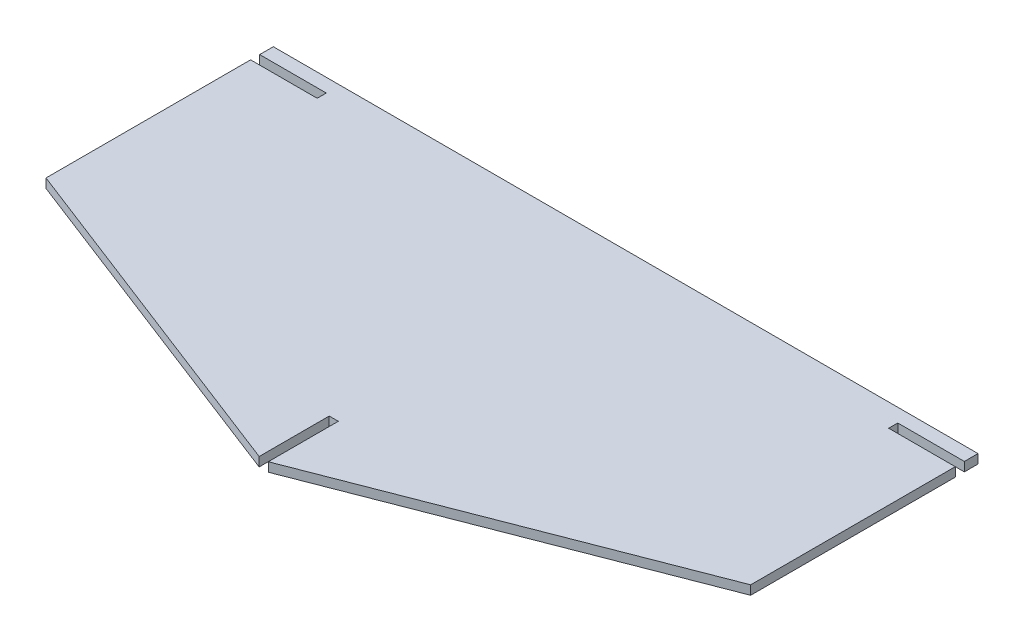
ISO-10303-21;
HEADER;
FILE_DESCRIPTION(('STEP AP214'),'2;1');
FILE_NAME('part.step','',(''),(''),'','','');
FILE_SCHEMA(('AUTOMOTIVE_DESIGN { 1 0 10303 214 1 1 1 1 }'));
ENDSEC;
DATA;
#1=APPLICATION_CONTEXT('core data for automotive mechanical design processes');
#2=APPLICATION_PROTOCOL_DEFINITION('international standard','automotive_design',2000,#1);
#3=PRODUCT_CONTEXT('',#1,'mechanical');
#4=PRODUCT('Part','Part','',(#3));
#5=PRODUCT_RELATED_PRODUCT_CATEGORY('part','',(#4));
#6=PRODUCT_DEFINITION_FORMATION('','',#4);
#7=PRODUCT_DEFINITION_CONTEXT('part definition',#1,'design');
#8=PRODUCT_DEFINITION('design','',#6,#7);
#9=PRODUCT_DEFINITION_SHAPE('','',#8);
#10=(LENGTH_UNIT() NAMED_UNIT(*) SI_UNIT(.MILLI.,.METRE.));
#11=(NAMED_UNIT(*) PLANE_ANGLE_UNIT() SI_UNIT($,.RADIAN.));
#12=(NAMED_UNIT(*) SI_UNIT($,.STERADIAN.) SOLID_ANGLE_UNIT());
#13=UNCERTAINTY_MEASURE_WITH_UNIT(LENGTH_MEASURE(1.E-05),#10,'distance_accuracy_value','');
#14=(GEOMETRIC_REPRESENTATION_CONTEXT(3) GLOBAL_UNCERTAINTY_ASSIGNED_CONTEXT((#13)) GLOBAL_UNIT_ASSIGNED_CONTEXT((#10,
#11,#12)) REPRESENTATION_CONTEXT('',''));
#15=CARTESIAN_POINT('',(0.,0.,0.));
#16=DIRECTION('',(0.,0.,1.));
#17=DIRECTION('',(1.,0.,0.));
#18=AXIS2_PLACEMENT_3D('',#15,#16,#17);
#19=CARTESIAN_POINT('',(74.0633484162896,4.,191.330316742081));
#20=DIRECTION('',(-0.360994102557712,0.,-0.93256809827409));
#21=DIRECTION('',(-0.93256809827409,0.,0.360994102557712));
#22=AXIS2_PLACEMENT_3D('',#19,#20,#21);
#23=PLANE('',#22);
#24=DIRECTION('',(0.93256809827409,0.,-0.360994102557712));
#25=VECTOR('',#24,1.);
#26=CARTESIAN_POINT('',(74.0633484162896,0.,191.330316742081));
#27=LINE('',#26,#25);
#28=CARTESIAN_POINT('',(157.,0.,159.225806451613));
#29=VERTEX_POINT('',#28);
#30=CARTESIAN_POINT('',(310.,0.,100.));
#31=VERTEX_POINT('',#30);
#32=EDGE_CURVE('E177',#29,#31,#27,.T.);
#33=ORIENTED_EDGE('',*,*,#32,.T.);
#34=DIRECTION('',(0.,-1.,0.));
#35=VECTOR('',#34,1.);
#36=CARTESIAN_POINT('',(310.,4.,100.));
#37=LINE('',#36,#35);
#38=CARTESIAN_POINT('',(310.,4.,100.));
#39=VERTEX_POINT('',#38);
#40=EDGE_CURVE('E11',#39,#31,#37,.T.);
#41=ORIENTED_EDGE('',*,*,#40,.F.);
#42=DIRECTION('',(0.93256809827409,0.,-0.360994102557712));
#43=VECTOR('',#42,1.);
#44=CARTESIAN_POINT('',(74.0633484162896,4.,191.330316742081));
#45=LINE('',#44,#43);
#46=CARTESIAN_POINT('',(157.,4.,159.225806451613));
#47=VERTEX_POINT('',#46);
#48=EDGE_CURVE('E112',#47,#39,#45,.T.);
#49=ORIENTED_EDGE('',*,*,#48,.F.);
#50=DIRECTION('',(0.,-1.,0.));
#51=VECTOR('',#50,1.);
#52=CARTESIAN_POINT('',(157.,4.,159.225806451613));
#53=LINE('',#52,#51);
#54=EDGE_CURVE('E50',#47,#29,#53,.T.);
#55=ORIENTED_EDGE('',*,*,#54,.T.);
#56=EDGE_LOOP('',(#33,#41,#49,#55));
#57=FACE_BOUND('',#56,.T.);
#58=ADVANCED_FACE('F34',(#57),#23,.F.);
#59=CARTESIAN_POINT('',(310.,4.,0.));
#60=DIRECTION('',(1.,0.,0.));
#61=DIRECTION('',(0.,0.,-1.));
#62=AXIS2_PLACEMENT_3D('',#59,#60,#61);
#63=PLANE('',#62);
#64=DIRECTION('',(0.,0.,1.));
#65=VECTOR('',#64,1.);
#66=CARTESIAN_POINT('',(310.,0.,0.));
#67=LINE('',#66,#65);
#68=CARTESIAN_POINT('',(310.,0.,10.));
#69=VERTEX_POINT('',#68);
#70=EDGE_CURVE('E179',#69,#31,#67,.T.);
#71=ORIENTED_EDGE('',*,*,#70,.F.);
#72=DIRECTION('',(0.,-1.,0.));
#73=VECTOR('',#72,1.);
#74=CARTESIAN_POINT('',(310.,4.,10.));
#75=LINE('',#74,#73);
#76=CARTESIAN_POINT('',(310.,4.,10.));
#77=VERTEX_POINT('',#76);
#78=EDGE_CURVE('E42',#77,#69,#75,.T.);
#79=ORIENTED_EDGE('',*,*,#78,.F.);
#80=DIRECTION('',(0.,0.,1.));
#81=VECTOR('',#80,1.);
#82=CARTESIAN_POINT('',(310.,4.,0.));
#83=LINE('',#82,#81);
#84=EDGE_CURVE('E252',#77,#39,#83,.T.);
#85=ORIENTED_EDGE('',*,*,#84,.T.);
#86=ORIENTED_EDGE('',*,*,#40,.T.);
#87=EDGE_LOOP('',(#71,#79,#85,#86));
#88=FACE_BOUND('',#87,.T.);
#89=ADVANCED_FACE('F251',(#88),#63,.T.);
#90=CARTESIAN_POINT('',(0.,4.,10.));
#91=DIRECTION('',(0.,0.,1.));
#92=DIRECTION('',(1.,0.,0.));
#93=AXIS2_PLACEMENT_3D('',#90,#91,#92);
#94=PLANE('',#93);
#95=DIRECTION('',(-1.,0.,0.));
#96=VECTOR('',#95,1.);
#97=CARTESIAN_POINT('',(0.,0.,10.));
#98=LINE('',#97,#96);
#99=CARTESIAN_POINT('',(280.7,0.,10.));
#100=VERTEX_POINT('',#99);
#101=EDGE_CURVE('E182',#69,#100,#98,.T.);
#102=ORIENTED_EDGE('',*,*,#101,.T.);
#103=DIRECTION('',(0.,-1.,0.));
#104=VECTOR('',#103,1.);
#105=CARTESIAN_POINT('',(280.7,4.,10.));
#106=LINE('',#105,#104);
#107=CARTESIAN_POINT('',(280.7,4.,10.));
#108=VERTEX_POINT('',#107);
#109=EDGE_CURVE('E238',#108,#100,#106,.T.);
#110=ORIENTED_EDGE('',*,*,#109,.F.);
#111=DIRECTION('',(-1.,0.,0.));
#112=VECTOR('',#111,1.);
#113=CARTESIAN_POINT('',(0.,4.,10.));
#114=LINE('',#113,#112);
#115=EDGE_CURVE('E244',#77,#108,#114,.T.);
#116=ORIENTED_EDGE('',*,*,#115,.F.);
#117=ORIENTED_EDGE('',*,*,#78,.T.);
#118=EDGE_LOOP('',(#102,#110,#116,#117));
#119=FACE_BOUND('',#118,.T.);
#120=ADVANCED_FACE('F242',(#119),#94,.F.);
#121=CARTESIAN_POINT('',(280.7,4.,0.));
#122=DIRECTION('',(1.,0.,0.));
#123=DIRECTION('',(0.,0.,-1.));
#124=AXIS2_PLACEMENT_3D('',#121,#122,#123);
#125=PLANE('',#124);
#126=DIRECTION('',(0.,0.,1.));
#127=VECTOR('',#126,1.);
#128=CARTESIAN_POINT('',(280.7,0.,0.));
#129=LINE('',#128,#127);
#130=CARTESIAN_POINT('',(280.7,0.,6.));
#131=VERTEX_POINT('',#130);
#132=EDGE_CURVE('E186',#131,#100,#129,.T.);
#133=ORIENTED_EDGE('',*,*,#132,.F.);
#134=DIRECTION('',(0.,-1.,0.));
#135=VECTOR('',#134,1.);
#136=CARTESIAN_POINT('',(280.7,4.,6.));
#137=LINE('',#136,#135);
#138=CARTESIAN_POINT('',(280.7,4.,6.));
#139=VERTEX_POINT('',#138);
#140=EDGE_CURVE('E236',#139,#131,#137,.T.);
#141=ORIENTED_EDGE('',*,*,#140,.F.);
#142=DIRECTION('',(0.,0.,1.));
#143=VECTOR('',#142,1.);
#144=CARTESIAN_POINT('',(280.7,4.,0.));
#145=LINE('',#144,#143);
#146=EDGE_CURVE('E411',#139,#108,#145,.T.);
#147=ORIENTED_EDGE('',*,*,#146,.T.);
#148=ORIENTED_EDGE('',*,*,#109,.T.);
#149=EDGE_LOOP('',(#133,#141,#147,#148));
#150=FACE_BOUND('',#149,.T.);
#151=ADVANCED_FACE('F272',(#150),#125,.T.);
#152=CARTESIAN_POINT('',(0.,4.,6.));
#153=DIRECTION('',(0.,0.,1.));
#154=DIRECTION('',(1.,0.,0.));
#155=AXIS2_PLACEMENT_3D('',#152,#153,#154);
#156=PLANE('',#155);
#157=DIRECTION('',(-1.,0.,0.));
#158=VECTOR('',#157,1.);
#159=CARTESIAN_POINT('',(0.,0.,6.));
#160=LINE('',#159,#158);
#161=CARTESIAN_POINT('',(310.,0.,6.));
#162=VERTEX_POINT('',#161);
#163=EDGE_CURVE('E189',#162,#131,#160,.T.);
#164=ORIENTED_EDGE('',*,*,#163,.F.);
#165=DIRECTION('',(0.,-1.,0.));
#166=VECTOR('',#165,1.);
#167=CARTESIAN_POINT('',(310.,4.,6.));
#168=LINE('',#167,#166);
#169=CARTESIAN_POINT('',(310.,4.,6.));
#170=VERTEX_POINT('',#169);
#171=EDGE_CURVE('E234',#170,#162,#168,.T.);
#172=ORIENTED_EDGE('',*,*,#171,.F.);
#173=DIRECTION('',(-1.,0.,0.));
#174=VECTOR('',#173,1.);
#175=CARTESIAN_POINT('',(0.,4.,6.));
#176=LINE('',#175,#174);
#177=EDGE_CURVE('E304',#170,#139,#176,.T.);
#178=ORIENTED_EDGE('',*,*,#177,.T.);
#179=ORIENTED_EDGE('',*,*,#140,.T.);
#180=EDGE_LOOP('',(#164,#172,#178,#179));
#181=FACE_BOUND('',#180,.T.);
#182=ADVANCED_FACE('F277',(#181),#156,.T.);
#183=CARTESIAN_POINT('',(310.,0.,0.));
#184=VERTEX_POINT('',#183);
#185=EDGE_CURVE('E183',#184,#162,#67,.T.);
#186=ORIENTED_EDGE('',*,*,#185,.F.);
#187=DIRECTION('',(0.,-1.,0.));
#188=VECTOR('',#187,1.);
#189=CARTESIAN_POINT('',(310.,4.,0.));
#190=LINE('',#189,#188);
#191=CARTESIAN_POINT('',(310.,4.,0.));
#192=VERTEX_POINT('',#191);
#193=EDGE_CURVE('E232',#192,#184,#190,.T.);
#194=ORIENTED_EDGE('',*,*,#193,.F.);
#195=EDGE_CURVE('E299',#192,#170,#83,.T.);
#196=ORIENTED_EDGE('',*,*,#195,.T.);
#197=ORIENTED_EDGE('',*,*,#171,.T.);
#198=EDGE_LOOP('',(#186,#194,#196,#197));
#199=FACE_BOUND('',#198,.T.);
#200=ADVANCED_FACE('F268',(#199),#63,.T.);
#201=CARTESIAN_POINT('',(0.,4.,0.));
#202=DIRECTION('',(0.,0.,-1.));
#203=DIRECTION('',(-1.,0.,0.));
#204=AXIS2_PLACEMENT_3D('',#201,#202,#203);
#205=PLANE('',#204);
#206=DIRECTION('',(1.,0.,0.));
#207=VECTOR('',#206,1.);
#208=CARTESIAN_POINT('',(0.,0.,0.));
#209=LINE('',#208,#207);
#210=CARTESIAN_POINT('',(0.,0.,0.));
#211=VERTEX_POINT('',#210);
#212=EDGE_CURVE('E192',#211,#184,#209,.T.);
#213=ORIENTED_EDGE('',*,*,#212,.F.);
#214=DIRECTION('',(0.,-1.,0.));
#215=VECTOR('',#214,1.);
#216=CARTESIAN_POINT('',(0.,4.,0.));
#217=LINE('',#216,#215);
#218=CARTESIAN_POINT('',(0.,4.,0.));
#219=VERTEX_POINT('',#218);
#220=EDGE_CURVE('E230',#219,#211,#217,.T.);
#221=ORIENTED_EDGE('',*,*,#220,.F.);
#222=DIRECTION('',(1.,0.,0.));
#223=VECTOR('',#222,1.);
#224=CARTESIAN_POINT('',(0.,4.,0.));
#225=LINE('',#224,#223);
#226=EDGE_CURVE('E297',#219,#192,#225,.T.);
#227=ORIENTED_EDGE('',*,*,#226,.T.);
#228=ORIENTED_EDGE('',*,*,#193,.T.);
#229=EDGE_LOOP('',(#213,#221,#227,#228));
#230=FACE_BOUND('',#229,.T.);
#231=ADVANCED_FACE('F276',(#230),#205,.T.);
#232=CARTESIAN_POINT('',(0.,4.,0.));
#233=DIRECTION('',(1.,0.,0.));
#234=DIRECTION('',(0.,0.,-1.));
#235=AXIS2_PLACEMENT_3D('',#232,#233,#234);
#236=PLANE('',#235);
#237=DIRECTION('',(0.,0.,1.));
#238=VECTOR('',#237,1.);
#239=CARTESIAN_POINT('',(0.,0.,0.));
#240=LINE('',#239,#238);
#241=CARTESIAN_POINT('',(0.,0.,6.));
#242=VERTEX_POINT('',#241);
#243=EDGE_CURVE('E195',#211,#242,#240,.T.);
#244=ORIENTED_EDGE('',*,*,#243,.T.);
#245=DIRECTION('',(0.,-1.,0.));
#246=VECTOR('',#245,1.);
#247=CARTESIAN_POINT('',(0.,4.,6.));
#248=LINE('',#247,#246);
#249=CARTESIAN_POINT('',(0.,4.,6.));
#250=VERTEX_POINT('',#249);
#251=EDGE_CURVE('E227',#250,#242,#248,.T.);
#252=ORIENTED_EDGE('',*,*,#251,.F.);
#253=DIRECTION('',(0.,0.,1.));
#254=VECTOR('',#253,1.);
#255=CARTESIAN_POINT('',(0.,4.,0.));
#256=LINE('',#255,#254);
#257=EDGE_CURVE('E298',#219,#250,#256,.T.);
#258=ORIENTED_EDGE('',*,*,#257,.F.);
#259=ORIENTED_EDGE('',*,*,#220,.T.);
#260=EDGE_LOOP('',(#244,#252,#258,#259));
#261=FACE_BOUND('',#260,.T.);
#262=ADVANCED_FACE('F283',(#261),#236,.F.);
#263=CARTESIAN_POINT('',(0.,4.,6.));
#264=DIRECTION('',(0.,0.,-1.));
#265=DIRECTION('',(-1.,0.,0.));
#266=AXIS2_PLACEMENT_3D('',#263,#264,#265);
#267=PLANE('',#266);
#268=DIRECTION('',(1.,0.,0.));
#269=VECTOR('',#268,1.);
#270=CARTESIAN_POINT('',(0.,0.,6.));
#271=LINE('',#270,#269);
#272=CARTESIAN_POINT('',(29.3,0.,6.));
#273=VERTEX_POINT('',#272);
#274=EDGE_CURVE('E197',#242,#273,#271,.T.);
#275=ORIENTED_EDGE('',*,*,#274,.T.);
#276=DIRECTION('',(0.,-1.,0.));
#277=VECTOR('',#276,1.);
#278=CARTESIAN_POINT('',(29.3,4.,6.));
#279=LINE('',#278,#277);
#280=CARTESIAN_POINT('',(29.3,4.,6.));
#281=VERTEX_POINT('',#280);
#282=EDGE_CURVE('E224',#281,#273,#279,.T.);
#283=ORIENTED_EDGE('',*,*,#282,.F.);
#284=DIRECTION('',(1.,0.,0.));
#285=VECTOR('',#284,1.);
#286=CARTESIAN_POINT('',(0.,4.,6.));
#287=LINE('',#286,#285);
#288=EDGE_CURVE('E301',#250,#281,#287,.T.);
#289=ORIENTED_EDGE('',*,*,#288,.F.);
#290=ORIENTED_EDGE('',*,*,#251,.T.);
#291=EDGE_LOOP('',(#275,#283,#289,#290));
#292=FACE_BOUND('',#291,.T.);
#293=ADVANCED_FACE('F333',(#292),#267,.F.);
#294=CARTESIAN_POINT('',(29.3,4.,0.));
#295=DIRECTION('',(1.,0.,0.));
#296=DIRECTION('',(0.,0.,-1.));
#297=AXIS2_PLACEMENT_3D('',#294,#295,#296);
#298=PLANE('',#297);
#299=DIRECTION('',(0.,0.,1.));
#300=VECTOR('',#299,1.);
#301=CARTESIAN_POINT('',(29.3,0.,0.));
#302=LINE('',#301,#300);
#303=CARTESIAN_POINT('',(29.3,0.,10.));
#304=VERTEX_POINT('',#303);
#305=EDGE_CURVE('E200',#273,#304,#302,.T.);
#306=ORIENTED_EDGE('',*,*,#305,.T.);
#307=DIRECTION('',(0.,-1.,0.));
#308=VECTOR('',#307,1.);
#309=CARTESIAN_POINT('',(29.3,4.,10.));
#310=LINE('',#309,#308);
#311=CARTESIAN_POINT('',(29.3,4.,10.));
#312=VERTEX_POINT('',#311);
#313=EDGE_CURVE('E222',#312,#304,#310,.T.);
#314=ORIENTED_EDGE('',*,*,#313,.F.);
#315=DIRECTION('',(0.,0.,1.));
#316=VECTOR('',#315,1.);
#317=CARTESIAN_POINT('',(29.3,4.,0.));
#318=LINE('',#317,#316);
#319=EDGE_CURVE('E310',#281,#312,#318,.T.);
#320=ORIENTED_EDGE('',*,*,#319,.F.);
#321=ORIENTED_EDGE('',*,*,#282,.T.);
#322=EDGE_LOOP('',(#306,#314,#320,#321));
#323=FACE_BOUND('',#322,.T.);
#324=ADVANCED_FACE('F330',(#323),#298,.F.);
#325=CARTESIAN_POINT('',(0.,4.,10.));
#326=DIRECTION('',(0.,0.,-1.));
#327=DIRECTION('',(-1.,0.,0.));
#328=AXIS2_PLACEMENT_3D('',#325,#326,#327);
#329=PLANE('',#328);
#330=DIRECTION('',(1.,0.,0.));
#331=VECTOR('',#330,1.);
#332=CARTESIAN_POINT('',(0.,0.,10.));
#333=LINE('',#332,#331);
#334=CARTESIAN_POINT('',(0.,0.,10.));
#335=VERTEX_POINT('',#334);
#336=EDGE_CURVE('E203',#335,#304,#333,.T.);
#337=ORIENTED_EDGE('',*,*,#336,.F.);
#338=DIRECTION('',(0.,-1.,0.));
#339=VECTOR('',#338,1.);
#340=CARTESIAN_POINT('',(0.,4.,10.));
#341=LINE('',#340,#339);
#342=CARTESIAN_POINT('',(0.,4.,10.));
#343=VERTEX_POINT('',#342);
#344=EDGE_CURVE('E220',#343,#335,#341,.T.);
#345=ORIENTED_EDGE('',*,*,#344,.F.);
#346=DIRECTION('',(1.,0.,0.));
#347=VECTOR('',#346,1.);
#348=CARTESIAN_POINT('',(0.,4.,10.));
#349=LINE('',#348,#347);
#350=EDGE_CURVE('E312',#343,#312,#349,.T.);
#351=ORIENTED_EDGE('',*,*,#350,.T.);
#352=ORIENTED_EDGE('',*,*,#313,.T.);
#353=EDGE_LOOP('',(#337,#345,#351,#352));
#354=FACE_BOUND('',#353,.T.);
#355=ADVANCED_FACE('F326',(#354),#329,.T.);
#356=CARTESIAN_POINT('',(0.,0.,100.));
#357=VERTEX_POINT('',#356);
#358=EDGE_CURVE('E198',#335,#357,#240,.T.);
#359=ORIENTED_EDGE('',*,*,#358,.T.);
#360=DIRECTION('',(0.,-1.,0.));
#361=VECTOR('',#360,1.);
#362=CARTESIAN_POINT('',(0.,4.,100.));
#363=LINE('',#362,#361);
#364=CARTESIAN_POINT('',(0.,4.,100.));
#365=VERTEX_POINT('',#364);
#366=EDGE_CURVE('E217',#365,#357,#363,.T.);
#367=ORIENTED_EDGE('',*,*,#366,.F.);
#368=EDGE_CURVE('E303',#343,#365,#256,.T.);
#369=ORIENTED_EDGE('',*,*,#368,.F.);
#370=ORIENTED_EDGE('',*,*,#344,.T.);
#371=EDGE_LOOP('',(#359,#367,#369,#370));
#372=FACE_BOUND('',#371,.T.);
#373=ADVANCED_FACE('F318',(#372),#236,.F.);
#374=CARTESIAN_POINT('',(-33.6651583710407,4.,86.9683257918552));
#375=DIRECTION('',(0.360994102557712,0.,-0.93256809827409));
#376=DIRECTION('',(-0.93256809827409,0.,-0.360994102557712));
#377=AXIS2_PLACEMENT_3D('',#374,#375,#376);
#378=PLANE('',#377);
#379=DIRECTION('',(0.93256809827409,0.,0.360994102557712));
#380=VECTOR('',#379,1.);
#381=CARTESIAN_POINT('',(-33.6651583710407,0.,86.9683257918552));
#382=LINE('',#381,#380);
#383=CARTESIAN_POINT('',(153.,0.,159.225806451613));
#384=VERTEX_POINT('',#383);
#385=EDGE_CURVE('E206',#357,#384,#382,.T.);
#386=ORIENTED_EDGE('',*,*,#385,.T.);
#387=DIRECTION('',(0.,-1.,0.));
#388=VECTOR('',#387,1.);
#389=CARTESIAN_POINT('',(153.,4.,159.225806451613));
#390=LINE('',#389,#388);
#391=CARTESIAN_POINT('',(153.,4.,159.225806451613));
#392=VERTEX_POINT('',#391);
#393=EDGE_CURVE('E169',#392,#384,#390,.T.);
#394=ORIENTED_EDGE('',*,*,#393,.F.);
#395=DIRECTION('',(0.93256809827409,0.,0.360994102557712));
#396=VECTOR('',#395,1.);
#397=CARTESIAN_POINT('',(-33.6651583710407,4.,86.9683257918552));
#398=LINE('',#397,#396);
#399=EDGE_CURVE('E157',#365,#392,#398,.T.);
#400=ORIENTED_EDGE('',*,*,#399,.F.);
#401=ORIENTED_EDGE('',*,*,#366,.T.);
#402=EDGE_LOOP('',(#386,#394,#400,#401));
#403=FACE_BOUND('',#402,.T.);
#404=ADVANCED_FACE('F322',(#403),#378,.F.);
#405=CARTESIAN_POINT('',(153.,4.,0.));
#406=DIRECTION('',(-1.,0.,0.));
#407=DIRECTION('',(0.,0.,1.));
#408=AXIS2_PLACEMENT_3D('',#405,#406,#407);
#409=PLANE('',#408);
#410=DIRECTION('',(0.,0.,-1.));
#411=VECTOR('',#410,1.);
#412=CARTESIAN_POINT('',(153.,0.,0.));
#413=LINE('',#412,#411);
#414=CARTESIAN_POINT('',(153.,0.,128.4));
#415=VERTEX_POINT('',#414);
#416=EDGE_CURVE('E166',#384,#415,#413,.T.);
#417=ORIENTED_EDGE('',*,*,#416,.T.);
#418=DIRECTION('',(0.,-1.,0.));
#419=VECTOR('',#418,1.);
#420=CARTESIAN_POINT('',(153.,4.,128.4));
#421=LINE('',#420,#419);
#422=CARTESIAN_POINT('',(153.,4.,128.4));
#423=VERTEX_POINT('',#422);
#424=EDGE_CURVE('E163',#423,#415,#421,.T.);
#425=ORIENTED_EDGE('',*,*,#424,.F.);
#426=DIRECTION('',(0.,0.,-1.));
#427=VECTOR('',#426,1.);
#428=CARTESIAN_POINT('',(153.,4.,0.));
#429=LINE('',#428,#427);
#430=EDGE_CURVE('E151',#392,#423,#429,.T.);
#431=ORIENTED_EDGE('',*,*,#430,.F.);
#432=ORIENTED_EDGE('',*,*,#393,.T.);
#433=EDGE_LOOP('',(#417,#425,#431,#432));
#434=FACE_BOUND('',#433,.T.);
#435=ADVANCED_FACE('F164',(#434),#409,.F.);
#436=CARTESIAN_POINT('',(0.,4.,128.4));
#437=DIRECTION('',(0.,0.,-1.));
#438=DIRECTION('',(-1.,0.,0.));
#439=AXIS2_PLACEMENT_3D('',#436,#437,#438);
#440=PLANE('',#439);
#441=DIRECTION('',(1.,0.,0.));
#442=VECTOR('',#441,1.);
#443=CARTESIAN_POINT('',(0.,0.,128.4));
#444=LINE('',#443,#442);
#445=CARTESIAN_POINT('',(157.,0.,128.4));
#446=VERTEX_POINT('',#445);
#447=EDGE_CURVE('E209',#415,#446,#444,.T.);
#448=ORIENTED_EDGE('',*,*,#447,.T.);
#449=DIRECTION('',(0.,-1.,0.));
#450=VECTOR('',#449,1.);
#451=CARTESIAN_POINT('',(157.,4.,128.4));
#452=LINE('',#451,#450);
#453=CARTESIAN_POINT('',(157.,4.,128.4));
#454=VERTEX_POINT('',#453);
#455=EDGE_CURVE('E100',#454,#446,#452,.T.);
#456=ORIENTED_EDGE('',*,*,#455,.F.);
#457=DIRECTION('',(1.,0.,0.));
#458=VECTOR('',#457,1.);
#459=CARTESIAN_POINT('',(0.,4.,128.4));
#460=LINE('',#459,#458);
#461=EDGE_CURVE('E155',#423,#454,#460,.T.);
#462=ORIENTED_EDGE('',*,*,#461,.F.);
#463=ORIENTED_EDGE('',*,*,#424,.T.);
#464=EDGE_LOOP('',(#448,#456,#462,#463));
#465=FACE_BOUND('',#464,.T.);
#466=ADVANCED_FACE('F171',(#465),#440,.F.);
#467=CARTESIAN_POINT('',(157.,4.,0.));
#468=DIRECTION('',(-1.,0.,0.));
#469=DIRECTION('',(0.,0.,1.));
#470=AXIS2_PLACEMENT_3D('',#467,#468,#469);
#471=PLANE('',#470);
#472=DIRECTION('',(0.,0.,-1.));
#473=VECTOR('',#472,1.);
#474=CARTESIAN_POINT('',(157.,0.,0.));
#475=LINE('',#474,#473);
#476=EDGE_CURVE('E211',#29,#446,#475,.T.);
#477=ORIENTED_EDGE('',*,*,#476,.F.);
#478=ORIENTED_EDGE('',*,*,#54,.F.);
#479=DIRECTION('',(0.,0.,-1.));
#480=VECTOR('',#479,1.);
#481=CARTESIAN_POINT('',(157.,4.,0.));
#482=LINE('',#481,#480);
#483=EDGE_CURVE('E172',#47,#454,#482,.T.);
#484=ORIENTED_EDGE('',*,*,#483,.T.);
#485=ORIENTED_EDGE('',*,*,#455,.T.);
#486=EDGE_LOOP('',(#477,#478,#484,#485));
#487=FACE_BOUND('',#486,.T.);
#488=ADVANCED_FACE('F253',(#487),#471,.T.);
#489=CARTESIAN_POINT('',(0.,4.,0.));
#490=DIRECTION('',(0.,1.,0.));
#491=DIRECTION('',(0.,0.,1.));
#492=AXIS2_PLACEMENT_3D('',#489,#490,#491);
#493=PLANE('',#492);
#494=ORIENTED_EDGE('',*,*,#48,.T.);
#495=ORIENTED_EDGE('',*,*,#84,.F.);
#496=ORIENTED_EDGE('',*,*,#115,.T.);
#497=ORIENTED_EDGE('',*,*,#146,.F.);
#498=ORIENTED_EDGE('',*,*,#177,.F.);
#499=ORIENTED_EDGE('',*,*,#195,.F.);
#500=ORIENTED_EDGE('',*,*,#226,.F.);
#501=ORIENTED_EDGE('',*,*,#257,.T.);
#502=ORIENTED_EDGE('',*,*,#288,.T.);
#503=ORIENTED_EDGE('',*,*,#319,.T.);
#504=ORIENTED_EDGE('',*,*,#350,.F.);
#505=ORIENTED_EDGE('',*,*,#368,.T.);
#506=ORIENTED_EDGE('',*,*,#399,.T.);
#507=ORIENTED_EDGE('',*,*,#430,.T.);
#508=ORIENTED_EDGE('',*,*,#461,.T.);
#509=ORIENTED_EDGE('',*,*,#483,.F.);
#510=EDGE_LOOP('',(#494,#495,#496,#497,#498,#499,#500,#501,#502,#503,#504,#505,#506,#507,#508,#509));
#511=FACE_BOUND('',#510,.T.);
#512=ADVANCED_FACE('F153',(#511),#493,.T.);
#513=CARTESIAN_POINT('',(0.,0.,0.));
#514=DIRECTION('',(0.,1.,0.));
#515=DIRECTION('',(0.,0.,1.));
#516=AXIS2_PLACEMENT_3D('',#513,#514,#515);
#517=PLANE('',#516);
#518=ORIENTED_EDGE('',*,*,#32,.F.);
#519=ORIENTED_EDGE('',*,*,#476,.T.);
#520=ORIENTED_EDGE('',*,*,#447,.F.);
#521=ORIENTED_EDGE('',*,*,#416,.F.);
#522=ORIENTED_EDGE('',*,*,#385,.F.);
#523=ORIENTED_EDGE('',*,*,#358,.F.);
#524=ORIENTED_EDGE('',*,*,#336,.T.);
#525=ORIENTED_EDGE('',*,*,#305,.F.);
#526=ORIENTED_EDGE('',*,*,#274,.F.);
#527=ORIENTED_EDGE('',*,*,#243,.F.);
#528=ORIENTED_EDGE('',*,*,#212,.T.);
#529=ORIENTED_EDGE('',*,*,#185,.T.);
#530=ORIENTED_EDGE('',*,*,#163,.T.);
#531=ORIENTED_EDGE('',*,*,#132,.T.);
#532=ORIENTED_EDGE('',*,*,#101,.F.);
#533=ORIENTED_EDGE('',*,*,#70,.T.);
#534=EDGE_LOOP('',(#518,#519,#520,#521,#522,#523,#524,#525,#526,#527,#528,#529,#530,#531,#532,#533));
#535=FACE_BOUND('',#534,.T.);
#536=ADVANCED_FACE('F249',(#535),#517,.F.);
#537=CLOSED_SHELL('',(#58,#89,#120,#151,#182,#200,#231,#262,#293,#324,#355,#373,#404,#435,#466,
#488,#512,#536));
#538=MANIFOLD_SOLID_BREP('B2',#537);
#539=ADVANCED_BREP_SHAPE_REPRESENTATION('',(#18,#538),#14);
#540=SHAPE_DEFINITION_REPRESENTATION(#9,#539);
ENDSEC;
END-ISO-10303-21;
